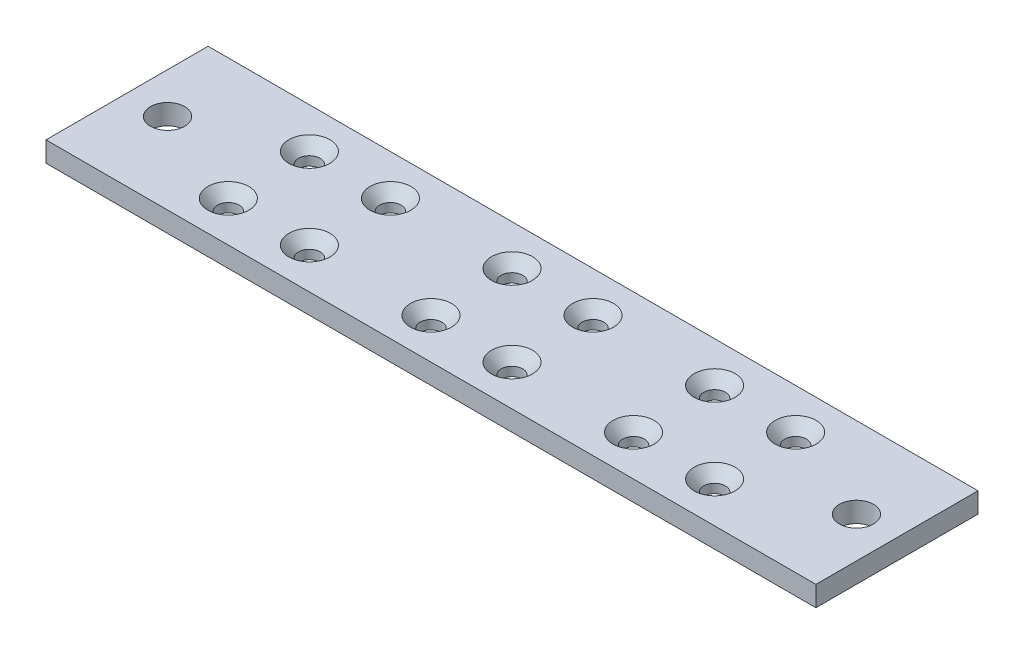
ISO-10303-21;
HEADER;
FILE_DESCRIPTION(('STEP AP214'),'2;1');
FILE_NAME('part.step','',(''),(''),'','','');
FILE_SCHEMA(('AUTOMOTIVE_DESIGN { 1 0 10303 214 1 1 1 1 }'));
ENDSEC;
DATA;
#1=APPLICATION_CONTEXT('core data for automotive mechanical design processes');
#2=APPLICATION_PROTOCOL_DEFINITION('international standard','automotive_design',2000,#1);
#3=PRODUCT_CONTEXT('',#1,'mechanical');
#4=PRODUCT('Part','Part','',(#3));
#5=PRODUCT_RELATED_PRODUCT_CATEGORY('part','',(#4));
#6=PRODUCT_DEFINITION_FORMATION('','',#4);
#7=PRODUCT_DEFINITION_CONTEXT('part definition',#1,'design');
#8=PRODUCT_DEFINITION('design','',#6,#7);
#9=PRODUCT_DEFINITION_SHAPE('','',#8);
#10=(LENGTH_UNIT() NAMED_UNIT(*) SI_UNIT(.MILLI.,.METRE.));
#11=(NAMED_UNIT(*) PLANE_ANGLE_UNIT() SI_UNIT($,.RADIAN.));
#12=(NAMED_UNIT(*) SI_UNIT($,.STERADIAN.) SOLID_ANGLE_UNIT());
#13=UNCERTAINTY_MEASURE_WITH_UNIT(LENGTH_MEASURE(1.E-05),#10,'distance_accuracy_value','');
#14=(GEOMETRIC_REPRESENTATION_CONTEXT(3) GLOBAL_UNCERTAINTY_ASSIGNED_CONTEXT((#13)) GLOBAL_UNIT_ASSIGNED_CONTEXT((#10,
#11,#12)) REPRESENTATION_CONTEXT('',''));
#15=CARTESIAN_POINT('',(0.,0.,0.));
#16=DIRECTION('',(0.,0.,1.));
#17=DIRECTION('',(1.,0.,0.));
#18=AXIS2_PLACEMENT_3D('',#15,#16,#17);
#19=CARTESIAN_POINT('',(120.65,6.35,25.4));
#20=DIRECTION('',(-1.,0.,0.));
#21=DIRECTION('',(0.,0.,1.));
#22=AXIS2_PLACEMENT_3D('',#19,#20,#21);
#23=PLANE('',#22);
#24=DIRECTION('',(0.,0.,-1.));
#25=VECTOR('',#24,1.);
#26=CARTESIAN_POINT('',(120.65,0.,25.4));
#27=LINE('',#26,#25);
#28=CARTESIAN_POINT('',(120.65,0.,25.4));
#29=VERTEX_POINT('',#28);
#30=CARTESIAN_POINT('',(120.65,0.,-25.4));
#31=VERTEX_POINT('',#30);
#32=EDGE_CURVE('E108',#29,#31,#27,.T.);
#33=ORIENTED_EDGE('',*,*,#32,.T.);
#34=DIRECTION('',(0.,-1.,0.));
#35=VECTOR('',#34,1.);
#36=CARTESIAN_POINT('',(120.65,6.35,-25.4));
#37=LINE('',#36,#35);
#38=CARTESIAN_POINT('',(120.65,6.35,-25.4));
#39=VERTEX_POINT('',#38);
#40=EDGE_CURVE('E11',#39,#31,#37,.T.);
#41=ORIENTED_EDGE('',*,*,#40,.F.);
#42=DIRECTION('',(0.,0.,-1.));
#43=VECTOR('',#42,1.);
#44=CARTESIAN_POINT('',(120.65,6.35,25.4));
#45=LINE('',#44,#43);
#46=CARTESIAN_POINT('',(120.65,6.35,25.4));
#47=VERTEX_POINT('',#46);
#48=EDGE_CURVE('E96',#47,#39,#45,.T.);
#49=ORIENTED_EDGE('',*,*,#48,.F.);
#50=DIRECTION('',(0.,-1.,0.));
#51=VECTOR('',#50,1.);
#52=CARTESIAN_POINT('',(120.65,6.35,25.4));
#53=LINE('',#52,#51);
#54=EDGE_CURVE('E104',#47,#29,#53,.T.);
#55=ORIENTED_EDGE('',*,*,#54,.T.);
#56=EDGE_LOOP('',(#33,#41,#49,#55));
#57=FACE_BOUND('',#56,.T.);
#58=ADVANCED_FACE('F45',(#57),#23,.F.);
#59=CARTESIAN_POINT('',(-120.65,6.35,-25.4));
#60=DIRECTION('',(0.,0.,1.));
#61=DIRECTION('',(1.,0.,0.));
#62=AXIS2_PLACEMENT_3D('',#59,#60,#61);
#63=PLANE('',#62);
#64=DIRECTION('',(-1.,0.,0.));
#65=VECTOR('',#64,1.);
#66=CARTESIAN_POINT('',(-120.65,0.,-25.4));
#67=LINE('',#66,#65);
#68=CARTESIAN_POINT('',(-120.65,0.,-25.4));
#69=VERTEX_POINT('',#68);
#70=EDGE_CURVE('E100',#31,#69,#67,.T.);
#71=ORIENTED_EDGE('',*,*,#70,.T.);
#72=DIRECTION('',(0.,-1.,0.));
#73=VECTOR('',#72,1.);
#74=CARTESIAN_POINT('',(-120.65,6.35,-25.4));
#75=LINE('',#74,#73);
#76=CARTESIAN_POINT('',(-120.65,6.35,-25.4));
#77=VERTEX_POINT('',#76);
#78=EDGE_CURVE('E53',#77,#69,#75,.T.);
#79=ORIENTED_EDGE('',*,*,#78,.F.);
#80=DIRECTION('',(-1.,0.,0.));
#81=VECTOR('',#80,1.);
#82=CARTESIAN_POINT('',(-120.65,6.35,-25.4));
#83=LINE('',#82,#81);
#84=EDGE_CURVE('E91',#39,#77,#83,.T.);
#85=ORIENTED_EDGE('',*,*,#84,.F.);
#86=ORIENTED_EDGE('',*,*,#40,.T.);
#87=EDGE_LOOP('',(#71,#79,#85,#86));
#88=FACE_BOUND('',#87,.T.);
#89=ADVANCED_FACE('F99',(#88),#63,.F.);
#90=CARTESIAN_POINT('',(-120.65,6.35,25.4));
#91=DIRECTION('',(1.,0.,0.));
#92=DIRECTION('',(0.,0.,-1.));
#93=AXIS2_PLACEMENT_3D('',#90,#91,#92);
#94=PLANE('',#93);
#95=DIRECTION('',(0.,0.,1.));
#96=VECTOR('',#95,1.);
#97=CARTESIAN_POINT('',(-120.65,0.,25.4));
#98=LINE('',#97,#96);
#99=CARTESIAN_POINT('',(-120.65,0.,25.4));
#100=VERTEX_POINT('',#99);
#101=EDGE_CURVE('E78',#69,#100,#98,.T.);
#102=ORIENTED_EDGE('',*,*,#101,.T.);
#103=DIRECTION('',(0.,-1.,0.));
#104=VECTOR('',#103,1.);
#105=CARTESIAN_POINT('',(-120.65,6.35,25.4));
#106=LINE('',#105,#104);
#107=CARTESIAN_POINT('',(-120.65,6.35,25.4));
#108=VERTEX_POINT('',#107);
#109=EDGE_CURVE('E101',#108,#100,#106,.T.);
#110=ORIENTED_EDGE('',*,*,#109,.F.);
#111=DIRECTION('',(0.,0.,1.));
#112=VECTOR('',#111,1.);
#113=CARTESIAN_POINT('',(-120.65,6.35,25.4));
#114=LINE('',#113,#112);
#115=EDGE_CURVE('E94',#77,#108,#114,.T.);
#116=ORIENTED_EDGE('',*,*,#115,.F.);
#117=ORIENTED_EDGE('',*,*,#78,.T.);
#118=EDGE_LOOP('',(#102,#110,#116,#117));
#119=FACE_BOUND('',#118,.T.);
#120=ADVANCED_FACE('F102',(#119),#94,.F.);
#121=CARTESIAN_POINT('',(-120.65,6.35,25.4));
#122=DIRECTION('',(0.,0.,-1.));
#123=DIRECTION('',(-1.,0.,0.));
#124=AXIS2_PLACEMENT_3D('',#121,#122,#123);
#125=PLANE('',#124);
#126=DIRECTION('',(1.,0.,0.));
#127=VECTOR('',#126,1.);
#128=CARTESIAN_POINT('',(-120.65,0.,25.4));
#129=LINE('',#128,#127);
#130=EDGE_CURVE('E84',#100,#29,#129,.T.);
#131=ORIENTED_EDGE('',*,*,#130,.T.);
#132=ORIENTED_EDGE('',*,*,#54,.F.);
#133=DIRECTION('',(1.,0.,0.));
#134=VECTOR('',#133,1.);
#135=CARTESIAN_POINT('',(-120.65,6.35,25.4));
#136=LINE('',#135,#134);
#137=EDGE_CURVE('E61',#108,#47,#136,.T.);
#138=ORIENTED_EDGE('',*,*,#137,.F.);
#139=ORIENTED_EDGE('',*,*,#109,.T.);
#140=EDGE_LOOP('',(#131,#132,#138,#139));
#141=FACE_BOUND('',#140,.T.);
#142=ADVANCED_FACE('F116',(#141),#125,.F.);
#143=CARTESIAN_POINT('',(0.,6.35,0.));
#144=DIRECTION('',(0.,-1.,0.));
#145=DIRECTION('',(0.,0.,-1.));
#146=AXIS2_PLACEMENT_3D('',#143,#144,#145);
#147=PLANE('',#146);
#148=CARTESIAN_POINT('',(-107.95,6.35,0.));
#149=DIRECTION('',(0.,1.,0.));
#150=DIRECTION('',(0.,0.,1.));
#151=AXIS2_PLACEMENT_3D('',#148,#149,#150);
#152=CIRCLE('',#151,5.35813);
#153=CARTESIAN_POINT('',(-107.95,6.35,5.35813000000002));
#154=VERTEX_POINT('',#153);
#155=EDGE_CURVE('E238',#154,#154,#152,.T.);
#156=ORIENTED_EDGE('',*,*,#155,.F.);
#157=EDGE_LOOP('',(#156));
#158=FACE_BOUND('',#157,.T.);
#159=CARTESIAN_POINT('',(107.95,6.35,0.));
#160=DIRECTION('',(0.,1.,0.));
#161=DIRECTION('',(0.,0.,1.));
#162=AXIS2_PLACEMENT_3D('',#159,#160,#161);
#163=CIRCLE('',#162,5.35813);
#164=CARTESIAN_POINT('',(107.95,6.35,5.35812999999998));
#165=VERTEX_POINT('',#164);
#166=EDGE_CURVE('E232',#165,#165,#163,.T.);
#167=ORIENTED_EDGE('',*,*,#166,.F.);
#168=EDGE_LOOP('',(#167));
#169=FACE_BOUND('',#168,.T.);
#170=CARTESIAN_POINT('',(12.7,6.35,-12.7));
#171=DIRECTION('',(0.,1.,0.));
#172=DIRECTION('',(0.,0.,1.));
#173=AXIS2_PLACEMENT_3D('',#170,#171,#172);
#174=CIRCLE('',#173,6.4389);
#175=CARTESIAN_POINT('',(12.7,6.35,-6.2611));
#176=VERTEX_POINT('',#175);
#177=EDGE_CURVE('E226',#176,#176,#174,.T.);
#178=ORIENTED_EDGE('',*,*,#177,.F.);
#179=EDGE_LOOP('',(#178));
#180=FACE_BOUND('',#179,.T.);
#181=CARTESIAN_POINT('',(-12.7,6.35,12.7));
#182=DIRECTION('',(0.,1.,0.));
#183=DIRECTION('',(0.,0.,1.));
#184=AXIS2_PLACEMENT_3D('',#181,#182,#183);
#185=CIRCLE('',#184,6.4389);
#186=CARTESIAN_POINT('',(-12.7,6.35,19.1389));
#187=VERTEX_POINT('',#186);
#188=EDGE_CURVE('E217',#187,#187,#185,.T.);
#189=ORIENTED_EDGE('',*,*,#188,.F.);
#190=EDGE_LOOP('',(#189));
#191=FACE_BOUND('',#190,.T.);
#192=CARTESIAN_POINT('',(-12.7,6.35,-12.7));
#193=DIRECTION('',(0.,1.,0.));
#194=DIRECTION('',(0.,0.,1.));
#195=AXIS2_PLACEMENT_3D('',#192,#193,#194);
#196=CIRCLE('',#195,6.4389);
#197=CARTESIAN_POINT('',(-12.7,6.35,-6.2611));
#198=VERTEX_POINT('',#197);
#199=EDGE_CURVE('E208',#198,#198,#196,.T.);
#200=ORIENTED_EDGE('',*,*,#199,.F.);
#201=EDGE_LOOP('',(#200));
#202=FACE_BOUND('',#201,.T.);
#203=CARTESIAN_POINT('',(12.7,6.35,12.7));
#204=DIRECTION('',(0.,1.,0.));
#205=DIRECTION('',(0.,0.,1.));
#206=AXIS2_PLACEMENT_3D('',#203,#204,#205);
#207=CIRCLE('',#206,6.4389);
#208=CARTESIAN_POINT('',(12.7,6.35,19.1389));
#209=VERTEX_POINT('',#208);
#210=EDGE_CURVE('E199',#209,#209,#207,.T.);
#211=ORIENTED_EDGE('',*,*,#210,.F.);
#212=EDGE_LOOP('',(#211));
#213=FACE_BOUND('',#212,.T.);
#214=CARTESIAN_POINT('',(-50.8,6.35,-12.7));
#215=DIRECTION('',(0.,1.,0.));
#216=DIRECTION('',(0.,0.,1.));
#217=AXIS2_PLACEMENT_3D('',#214,#215,#216);
#218=CIRCLE('',#217,6.4389);
#219=CARTESIAN_POINT('',(-50.8,6.35,-6.26109999999999));
#220=VERTEX_POINT('',#219);
#221=EDGE_CURVE('E190',#220,#220,#218,.T.);
#222=ORIENTED_EDGE('',*,*,#221,.F.);
#223=EDGE_LOOP('',(#222));
#224=FACE_BOUND('',#223,.T.);
#225=CARTESIAN_POINT('',(-76.2,6.35,12.7));
#226=DIRECTION('',(0.,1.,0.));
#227=DIRECTION('',(0.,0.,1.));
#228=AXIS2_PLACEMENT_3D('',#225,#226,#227);
#229=CIRCLE('',#228,6.4389);
#230=CARTESIAN_POINT('',(-76.2,6.35,19.1389));
#231=VERTEX_POINT('',#230);
#232=EDGE_CURVE('E181',#231,#231,#229,.T.);
#233=ORIENTED_EDGE('',*,*,#232,.F.);
#234=EDGE_LOOP('',(#233));
#235=FACE_BOUND('',#234,.T.);
#236=CARTESIAN_POINT('',(-76.2,6.35,-12.7));
#237=DIRECTION('',(0.,1.,0.));
#238=DIRECTION('',(0.,0.,1.));
#239=AXIS2_PLACEMENT_3D('',#236,#237,#238);
#240=CIRCLE('',#239,6.4389);
#241=CARTESIAN_POINT('',(-76.2,6.35,-6.2611));
#242=VERTEX_POINT('',#241);
#243=EDGE_CURVE('E172',#242,#242,#240,.T.);
#244=ORIENTED_EDGE('',*,*,#243,.F.);
#245=EDGE_LOOP('',(#244));
#246=FACE_BOUND('',#245,.T.);
#247=CARTESIAN_POINT('',(-50.8,6.35,12.7));
#248=DIRECTION('',(0.,1.,0.));
#249=DIRECTION('',(0.,0.,1.));
#250=AXIS2_PLACEMENT_3D('',#247,#248,#249);
#251=CIRCLE('',#250,6.4389);
#252=CARTESIAN_POINT('',(-50.8,6.35,19.1389));
#253=VERTEX_POINT('',#252);
#254=EDGE_CURVE('E163',#253,#253,#251,.T.);
#255=ORIENTED_EDGE('',*,*,#254,.F.);
#256=EDGE_LOOP('',(#255));
#257=FACE_BOUND('',#256,.T.);
#258=CARTESIAN_POINT('',(76.2,6.35,-12.7));
#259=DIRECTION('',(0.,1.,0.));
#260=DIRECTION('',(0.,0.,1.));
#261=AXIS2_PLACEMENT_3D('',#258,#259,#260);
#262=CIRCLE('',#261,6.4389);
#263=CARTESIAN_POINT('',(76.2,6.35,-6.2611));
#264=VERTEX_POINT('',#263);
#265=EDGE_CURVE('E154',#264,#264,#262,.T.);
#266=ORIENTED_EDGE('',*,*,#265,.F.);
#267=EDGE_LOOP('',(#266));
#268=FACE_BOUND('',#267,.T.);
#269=CARTESIAN_POINT('',(50.8,6.35,12.7));
#270=DIRECTION('',(0.,1.,0.));
#271=DIRECTION('',(0.,0.,1.));
#272=AXIS2_PLACEMENT_3D('',#269,#270,#271);
#273=CIRCLE('',#272,6.4389);
#274=CARTESIAN_POINT('',(50.8,6.35,19.1389));
#275=VERTEX_POINT('',#274);
#276=EDGE_CURVE('E145',#275,#275,#273,.T.);
#277=ORIENTED_EDGE('',*,*,#276,.F.);
#278=EDGE_LOOP('',(#277));
#279=FACE_BOUND('',#278,.T.);
#280=CARTESIAN_POINT('',(50.8,6.35,-12.7));
#281=DIRECTION('',(0.,1.,0.));
#282=DIRECTION('',(0.,0.,1.));
#283=AXIS2_PLACEMENT_3D('',#280,#281,#282);
#284=CIRCLE('',#283,6.4389);
#285=CARTESIAN_POINT('',(50.8,6.35,-6.26109999999999));
#286=VERTEX_POINT('',#285);
#287=EDGE_CURVE('E136',#286,#286,#284,.T.);
#288=ORIENTED_EDGE('',*,*,#287,.F.);
#289=EDGE_LOOP('',(#288));
#290=FACE_BOUND('',#289,.T.);
#291=CARTESIAN_POINT('',(76.2,6.35,12.7));
#292=DIRECTION('',(0.,1.,0.));
#293=DIRECTION('',(0.,0.,1.));
#294=AXIS2_PLACEMENT_3D('',#291,#292,#293);
#295=CIRCLE('',#294,6.4389);
#296=CARTESIAN_POINT('',(76.2,6.35,19.1389));
#297=VERTEX_POINT('',#296);
#298=EDGE_CURVE('E127',#297,#297,#295,.T.);
#299=ORIENTED_EDGE('',*,*,#298,.F.);
#300=EDGE_LOOP('',(#299));
#301=FACE_BOUND('',#300,.T.);
#302=ORIENTED_EDGE('',*,*,#48,.T.);
#303=ORIENTED_EDGE('',*,*,#84,.T.);
#304=ORIENTED_EDGE('',*,*,#115,.T.);
#305=ORIENTED_EDGE('',*,*,#137,.T.);
#306=EDGE_LOOP('',(#302,#303,#304,#305));
#307=FACE_BOUND('',#306,.T.);
#308=ADVANCED_FACE('F92',(#158,#169,#180,#191,#202,#213,#224,#235,#246,#257,#268,#279,#290,#301,
#307),#147,.F.);
#309=CARTESIAN_POINT('',(0.,0.,0.));
#310=DIRECTION('',(0.,-1.,0.));
#311=DIRECTION('',(0.,0.,-1.));
#312=AXIS2_PLACEMENT_3D('',#309,#310,#311);
#313=PLANE('',#312);
#314=CARTESIAN_POINT('',(-107.95,0.,0.));
#315=DIRECTION('',(0.,1.,0.));
#316=DIRECTION('',(0.,0.,1.));
#317=AXIS2_PLACEMENT_3D('',#314,#315,#316);
#318=CIRCLE('',#317,5.35813);
#319=CARTESIAN_POINT('',(-107.95,0.,5.35813000000002));
#320=VERTEX_POINT('',#319);
#321=EDGE_CURVE('E235',#320,#320,#318,.T.);
#322=ORIENTED_EDGE('',*,*,#321,.T.);
#323=EDGE_LOOP('',(#322));
#324=FACE_BOUND('',#323,.T.);
#325=CARTESIAN_POINT('',(107.95,0.,0.));
#326=DIRECTION('',(0.,1.,0.));
#327=DIRECTION('',(0.,0.,1.));
#328=AXIS2_PLACEMENT_3D('',#325,#326,#327);
#329=CIRCLE('',#328,5.35813);
#330=CARTESIAN_POINT('',(107.95,0.,5.35812999999998));
#331=VERTEX_POINT('',#330);
#332=EDGE_CURVE('E229',#331,#331,#329,.T.);
#333=ORIENTED_EDGE('',*,*,#332,.T.);
#334=EDGE_LOOP('',(#333));
#335=FACE_BOUND('',#334,.T.);
#336=CARTESIAN_POINT('',(12.7,0.,-12.7));
#337=DIRECTION('',(0.,1.,0.));
#338=DIRECTION('',(0.,0.,1.));
#339=AXIS2_PLACEMENT_3D('',#336,#337,#338);
#340=CIRCLE('',#339,3.3782);
#341=CARTESIAN_POINT('',(12.7,0.,-9.3218));
#342=VERTEX_POINT('',#341);
#343=EDGE_CURVE('E220',#342,#342,#340,.T.);
#344=ORIENTED_EDGE('',*,*,#343,.T.);
#345=EDGE_LOOP('',(#344));
#346=FACE_BOUND('',#345,.T.);
#347=CARTESIAN_POINT('',(-12.7,0.,12.7));
#348=DIRECTION('',(0.,1.,0.));
#349=DIRECTION('',(0.,0.,1.));
#350=AXIS2_PLACEMENT_3D('',#347,#348,#349);
#351=CIRCLE('',#350,3.3782);
#352=CARTESIAN_POINT('',(-12.7,0.,16.0782));
#353=VERTEX_POINT('',#352);
#354=EDGE_CURVE('E211',#353,#353,#351,.T.);
#355=ORIENTED_EDGE('',*,*,#354,.T.);
#356=EDGE_LOOP('',(#355));
#357=FACE_BOUND('',#356,.T.);
#358=CARTESIAN_POINT('',(-12.7,0.,-12.7));
#359=DIRECTION('',(0.,1.,0.));
#360=DIRECTION('',(0.,0.,1.));
#361=AXIS2_PLACEMENT_3D('',#358,#359,#360);
#362=CIRCLE('',#361,3.3782);
#363=CARTESIAN_POINT('',(-12.7,0.,-9.3218));
#364=VERTEX_POINT('',#363);
#365=EDGE_CURVE('E202',#364,#364,#362,.T.);
#366=ORIENTED_EDGE('',*,*,#365,.T.);
#367=EDGE_LOOP('',(#366));
#368=FACE_BOUND('',#367,.T.);
#369=CARTESIAN_POINT('',(12.7,0.,12.7));
#370=DIRECTION('',(0.,1.,0.));
#371=DIRECTION('',(0.,0.,1.));
#372=AXIS2_PLACEMENT_3D('',#369,#370,#371);
#373=CIRCLE('',#372,3.3782);
#374=CARTESIAN_POINT('',(12.7,0.,16.0782));
#375=VERTEX_POINT('',#374);
#376=EDGE_CURVE('E193',#375,#375,#373,.T.);
#377=ORIENTED_EDGE('',*,*,#376,.T.);
#378=EDGE_LOOP('',(#377));
#379=FACE_BOUND('',#378,.T.);
#380=CARTESIAN_POINT('',(-50.8,0.,-12.7));
#381=DIRECTION('',(0.,1.,0.));
#382=DIRECTION('',(0.,0.,1.));
#383=AXIS2_PLACEMENT_3D('',#380,#381,#382);
#384=CIRCLE('',#383,3.3782);
#385=CARTESIAN_POINT('',(-50.8,0.,-9.3218));
#386=VERTEX_POINT('',#385);
#387=EDGE_CURVE('E184',#386,#386,#384,.T.);
#388=ORIENTED_EDGE('',*,*,#387,.T.);
#389=EDGE_LOOP('',(#388));
#390=FACE_BOUND('',#389,.T.);
#391=CARTESIAN_POINT('',(-76.2,0.,12.7));
#392=DIRECTION('',(0.,1.,0.));
#393=DIRECTION('',(0.,0.,1.));
#394=AXIS2_PLACEMENT_3D('',#391,#392,#393);
#395=CIRCLE('',#394,3.3782);
#396=CARTESIAN_POINT('',(-76.2,0.,16.0782));
#397=VERTEX_POINT('',#396);
#398=EDGE_CURVE('E175',#397,#397,#395,.T.);
#399=ORIENTED_EDGE('',*,*,#398,.T.);
#400=EDGE_LOOP('',(#399));
#401=FACE_BOUND('',#400,.T.);
#402=CARTESIAN_POINT('',(-76.2,0.,-12.7));
#403=DIRECTION('',(0.,1.,0.));
#404=DIRECTION('',(0.,0.,1.));
#405=AXIS2_PLACEMENT_3D('',#402,#403,#404);
#406=CIRCLE('',#405,3.3782);
#407=CARTESIAN_POINT('',(-76.2,0.,-9.3218));
#408=VERTEX_POINT('',#407);
#409=EDGE_CURVE('E166',#408,#408,#406,.T.);
#410=ORIENTED_EDGE('',*,*,#409,.T.);
#411=EDGE_LOOP('',(#410));
#412=FACE_BOUND('',#411,.T.);
#413=CARTESIAN_POINT('',(-50.8,0.,12.7));
#414=DIRECTION('',(0.,1.,0.));
#415=DIRECTION('',(0.,0.,1.));
#416=AXIS2_PLACEMENT_3D('',#413,#414,#415);
#417=CIRCLE('',#416,3.3782);
#418=CARTESIAN_POINT('',(-50.8,0.,16.0782));
#419=VERTEX_POINT('',#418);
#420=EDGE_CURVE('E157',#419,#419,#417,.T.);
#421=ORIENTED_EDGE('',*,*,#420,.T.);
#422=EDGE_LOOP('',(#421));
#423=FACE_BOUND('',#422,.T.);
#424=CARTESIAN_POINT('',(76.2,0.,-12.7));
#425=DIRECTION('',(0.,1.,0.));
#426=DIRECTION('',(0.,0.,1.));
#427=AXIS2_PLACEMENT_3D('',#424,#425,#426);
#428=CIRCLE('',#427,3.3782);
#429=CARTESIAN_POINT('',(76.2,0.,-9.3218));
#430=VERTEX_POINT('',#429);
#431=EDGE_CURVE('E148',#430,#430,#428,.T.);
#432=ORIENTED_EDGE('',*,*,#431,.T.);
#433=EDGE_LOOP('',(#432));
#434=FACE_BOUND('',#433,.T.);
#435=CARTESIAN_POINT('',(50.8,0.,12.7));
#436=DIRECTION('',(0.,1.,0.));
#437=DIRECTION('',(0.,0.,1.));
#438=AXIS2_PLACEMENT_3D('',#435,#436,#437);
#439=CIRCLE('',#438,3.3782);
#440=CARTESIAN_POINT('',(50.8,0.,16.0782));
#441=VERTEX_POINT('',#440);
#442=EDGE_CURVE('E139',#441,#441,#439,.T.);
#443=ORIENTED_EDGE('',*,*,#442,.T.);
#444=EDGE_LOOP('',(#443));
#445=FACE_BOUND('',#444,.T.);
#446=CARTESIAN_POINT('',(50.8,0.,-12.7));
#447=DIRECTION('',(0.,1.,0.));
#448=DIRECTION('',(0.,0.,1.));
#449=AXIS2_PLACEMENT_3D('',#446,#447,#448);
#450=CIRCLE('',#449,3.3782);
#451=CARTESIAN_POINT('',(50.8,0.,-9.3218));
#452=VERTEX_POINT('',#451);
#453=EDGE_CURVE('E130',#452,#452,#450,.T.);
#454=ORIENTED_EDGE('',*,*,#453,.T.);
#455=EDGE_LOOP('',(#454));
#456=FACE_BOUND('',#455,.T.);
#457=CARTESIAN_POINT('',(76.2,0.,12.7));
#458=DIRECTION('',(0.,1.,0.));
#459=DIRECTION('',(0.,0.,1.));
#460=AXIS2_PLACEMENT_3D('',#457,#458,#459);
#461=CIRCLE('',#460,3.3782);
#462=CARTESIAN_POINT('',(76.2,0.,16.0782));
#463=VERTEX_POINT('',#462);
#464=EDGE_CURVE('E111',#463,#463,#461,.T.);
#465=ORIENTED_EDGE('',*,*,#464,.T.);
#466=EDGE_LOOP('',(#465));
#467=FACE_BOUND('',#466,.T.);
#468=ORIENTED_EDGE('',*,*,#32,.F.);
#469=ORIENTED_EDGE('',*,*,#130,.F.);
#470=ORIENTED_EDGE('',*,*,#101,.F.);
#471=ORIENTED_EDGE('',*,*,#70,.F.);
#472=EDGE_LOOP('',(#468,#469,#470,#471));
#473=FACE_BOUND('',#472,.T.);
#474=ADVANCED_FACE('F119',(#324,#335,#346,#357,#368,#379,#390,#401,#412,#423,#434,#445,#456,
#467,#473),#313,.T.);
#475=CARTESIAN_POINT('',(76.2,6.35,12.7));
#476=DIRECTION('',(0.,1.,0.));
#477=DIRECTION('',(0.,0.,1.));
#478=AXIS2_PLACEMENT_3D('',#475,#476,#477);
#479=CYLINDRICAL_SURFACE('',#478,3.3782);
#480=ORIENTED_EDGE('',*,*,#464,.F.);
#481=EDGE_LOOP('',(#480));
#482=FACE_BOUND('',#481,.T.);
#483=CARTESIAN_POINT('',(76.2,2.82906741601865,12.7));
#484=DIRECTION('',(0.,1.,0.));
#485=DIRECTION('',(0.,0.,1.));
#486=AXIS2_PLACEMENT_3D('',#483,#484,#485);
#487=CIRCLE('',#486,3.3782);
#488=CARTESIAN_POINT('',(76.2,2.82906741601865,16.0782));
#489=VERTEX_POINT('',#488);
#490=EDGE_CURVE('E124',#489,#489,#487,.T.);
#491=ORIENTED_EDGE('',*,*,#490,.T.);
#492=EDGE_LOOP('',(#491));
#493=FACE_BOUND('',#492,.T.);
#494=ADVANCED_FACE('F276',(#482,#493),#479,.F.);
#495=CARTESIAN_POINT('',(76.2,6.35,12.7));
#496=DIRECTION('',(0.,1.,0.));
#497=DIRECTION('',(0.,0.,1.));
#498=AXIS2_PLACEMENT_3D('',#495,#496,#497);
#499=CONICAL_SURFACE('',#498,6.4389,0.715584993317674);
#500=ORIENTED_EDGE('',*,*,#490,.F.);
#501=EDGE_LOOP('',(#500));
#502=FACE_BOUND('',#501,.T.);
#503=ORIENTED_EDGE('',*,*,#298,.T.);
#504=EDGE_LOOP('',(#503));
#505=FACE_BOUND('',#504,.T.);
#506=ADVANCED_FACE('F273',(#502,#505),#499,.F.);
#507=CARTESIAN_POINT('',(50.8,6.35,-12.7));
#508=DIRECTION('',(0.,1.,0.));
#509=DIRECTION('',(0.,0.,1.));
#510=AXIS2_PLACEMENT_3D('',#507,#508,#509);
#511=CYLINDRICAL_SURFACE('',#510,3.3782);
#512=ORIENTED_EDGE('',*,*,#453,.F.);
#513=EDGE_LOOP('',(#512));
#514=FACE_BOUND('',#513,.T.);
#515=CARTESIAN_POINT('',(50.8,2.82906741601865,-12.7));
#516=DIRECTION('',(0.,1.,0.));
#517=DIRECTION('',(0.,0.,1.));
#518=AXIS2_PLACEMENT_3D('',#515,#516,#517);
#519=CIRCLE('',#518,3.3782);
#520=CARTESIAN_POINT('',(50.8,2.82906741601865,-9.3218));
#521=VERTEX_POINT('',#520);
#522=EDGE_CURVE('E133',#521,#521,#519,.T.);
#523=ORIENTED_EDGE('',*,*,#522,.T.);
#524=EDGE_LOOP('',(#523));
#525=FACE_BOUND('',#524,.T.);
#526=ADVANCED_FACE('F275',(#514,#525),#511,.F.);
#527=CARTESIAN_POINT('',(50.8,6.35,-12.7));
#528=DIRECTION('',(0.,1.,0.));
#529=DIRECTION('',(0.,0.,1.));
#530=AXIS2_PLACEMENT_3D('',#527,#528,#529);
#531=CONICAL_SURFACE('',#530,6.4389,0.715584993317675);
#532=ORIENTED_EDGE('',*,*,#522,.F.);
#533=EDGE_LOOP('',(#532));
#534=FACE_BOUND('',#533,.T.);
#535=ORIENTED_EDGE('',*,*,#287,.T.);
#536=EDGE_LOOP('',(#535));
#537=FACE_BOUND('',#536,.T.);
#538=ADVANCED_FACE('F284',(#534,#537),#531,.F.);
#539=CARTESIAN_POINT('',(50.8,6.35,12.7));
#540=DIRECTION('',(0.,1.,0.));
#541=DIRECTION('',(0.,0.,1.));
#542=AXIS2_PLACEMENT_3D('',#539,#540,#541);
#543=CYLINDRICAL_SURFACE('',#542,3.3782);
#544=ORIENTED_EDGE('',*,*,#442,.F.);
#545=EDGE_LOOP('',(#544));
#546=FACE_BOUND('',#545,.T.);
#547=CARTESIAN_POINT('',(50.8,2.82906741601865,12.7));
#548=DIRECTION('',(0.,1.,0.));
#549=DIRECTION('',(0.,0.,1.));
#550=AXIS2_PLACEMENT_3D('',#547,#548,#549);
#551=CIRCLE('',#550,3.3782);
#552=CARTESIAN_POINT('',(50.8,2.82906741601865,16.0782));
#553=VERTEX_POINT('',#552);
#554=EDGE_CURVE('E142',#553,#553,#551,.T.);
#555=ORIENTED_EDGE('',*,*,#554,.T.);
#556=EDGE_LOOP('',(#555));
#557=FACE_BOUND('',#556,.T.);
#558=ADVANCED_FACE('F340',(#546,#557),#543,.F.);
#559=CARTESIAN_POINT('',(50.8,6.35,12.7));
#560=DIRECTION('',(0.,1.,0.));
#561=DIRECTION('',(0.,0.,1.));
#562=AXIS2_PLACEMENT_3D('',#559,#560,#561);
#563=CONICAL_SURFACE('',#562,6.4389,0.715584993317675);
#564=ORIENTED_EDGE('',*,*,#554,.F.);
#565=EDGE_LOOP('',(#564));
#566=FACE_BOUND('',#565,.T.);
#567=ORIENTED_EDGE('',*,*,#276,.T.);
#568=EDGE_LOOP('',(#567));
#569=FACE_BOUND('',#568,.T.);
#570=ADVANCED_FACE('F346',(#566,#569),#563,.F.);
#571=CARTESIAN_POINT('',(76.2,6.35,-12.7));
#572=DIRECTION('',(0.,1.,0.));
#573=DIRECTION('',(0.,0.,1.));
#574=AXIS2_PLACEMENT_3D('',#571,#572,#573);
#575=CYLINDRICAL_SURFACE('',#574,3.3782);
#576=ORIENTED_EDGE('',*,*,#431,.F.);
#577=EDGE_LOOP('',(#576));
#578=FACE_BOUND('',#577,.T.);
#579=CARTESIAN_POINT('',(76.2,2.82906741601865,-12.7));
#580=DIRECTION('',(0.,1.,0.));
#581=DIRECTION('',(0.,0.,1.));
#582=AXIS2_PLACEMENT_3D('',#579,#580,#581);
#583=CIRCLE('',#582,3.3782);
#584=CARTESIAN_POINT('',(76.2,2.82906741601865,-9.3218));
#585=VERTEX_POINT('',#584);
#586=EDGE_CURVE('E151',#585,#585,#583,.T.);
#587=ORIENTED_EDGE('',*,*,#586,.T.);
#588=EDGE_LOOP('',(#587));
#589=FACE_BOUND('',#588,.T.);
#590=ADVANCED_FACE('F351',(#578,#589),#575,.F.);
#591=CARTESIAN_POINT('',(76.2,6.35,-12.7));
#592=DIRECTION('',(0.,1.,0.));
#593=DIRECTION('',(0.,0.,1.));
#594=AXIS2_PLACEMENT_3D('',#591,#592,#593);
#595=CONICAL_SURFACE('',#594,6.4389,0.715584993317674);
#596=ORIENTED_EDGE('',*,*,#586,.F.);
#597=EDGE_LOOP('',(#596));
#598=FACE_BOUND('',#597,.T.);
#599=ORIENTED_EDGE('',*,*,#265,.T.);
#600=EDGE_LOOP('',(#599));
#601=FACE_BOUND('',#600,.T.);
#602=ADVANCED_FACE('F355',(#598,#601),#595,.F.);
#603=CARTESIAN_POINT('',(-50.8,6.35,12.7));
#604=DIRECTION('',(0.,1.,0.));
#605=DIRECTION('',(0.,0.,1.));
#606=AXIS2_PLACEMENT_3D('',#603,#604,#605);
#607=CYLINDRICAL_SURFACE('',#606,3.3782);
#608=ORIENTED_EDGE('',*,*,#420,.F.);
#609=EDGE_LOOP('',(#608));
#610=FACE_BOUND('',#609,.T.);
#611=CARTESIAN_POINT('',(-50.8,2.82906741601865,12.7));
#612=DIRECTION('',(0.,1.,0.));
#613=DIRECTION('',(0.,0.,1.));
#614=AXIS2_PLACEMENT_3D('',#611,#612,#613);
#615=CIRCLE('',#614,3.3782);
#616=CARTESIAN_POINT('',(-50.8,2.82906741601865,16.0782));
#617=VERTEX_POINT('',#616);
#618=EDGE_CURVE('E160',#617,#617,#615,.T.);
#619=ORIENTED_EDGE('',*,*,#618,.T.);
#620=EDGE_LOOP('',(#619));
#621=FACE_BOUND('',#620,.T.);
#622=ADVANCED_FACE('F359',(#610,#621),#607,.F.);
#623=CARTESIAN_POINT('',(-50.8,6.35,12.7));
#624=DIRECTION('',(0.,1.,0.));
#625=DIRECTION('',(0.,0.,1.));
#626=AXIS2_PLACEMENT_3D('',#623,#624,#625);
#627=CONICAL_SURFACE('',#626,6.4389,0.715584993317674);
#628=ORIENTED_EDGE('',*,*,#618,.F.);
#629=EDGE_LOOP('',(#628));
#630=FACE_BOUND('',#629,.T.);
#631=ORIENTED_EDGE('',*,*,#254,.T.);
#632=EDGE_LOOP('',(#631));
#633=FACE_BOUND('',#632,.T.);
#634=ADVANCED_FACE('F363',(#630,#633),#627,.F.);
#635=CARTESIAN_POINT('',(-76.2,6.35,-12.7));
#636=DIRECTION('',(0.,1.,0.));
#637=DIRECTION('',(0.,0.,1.));
#638=AXIS2_PLACEMENT_3D('',#635,#636,#637);
#639=CYLINDRICAL_SURFACE('',#638,3.3782);
#640=ORIENTED_EDGE('',*,*,#409,.F.);
#641=EDGE_LOOP('',(#640));
#642=FACE_BOUND('',#641,.T.);
#643=CARTESIAN_POINT('',(-76.2,2.82906741601865,-12.7));
#644=DIRECTION('',(0.,1.,0.));
#645=DIRECTION('',(0.,0.,1.));
#646=AXIS2_PLACEMENT_3D('',#643,#644,#645);
#647=CIRCLE('',#646,3.3782);
#648=CARTESIAN_POINT('',(-76.2,2.82906741601865,-9.3218));
#649=VERTEX_POINT('',#648);
#650=EDGE_CURVE('E169',#649,#649,#647,.T.);
#651=ORIENTED_EDGE('',*,*,#650,.T.);
#652=EDGE_LOOP('',(#651));
#653=FACE_BOUND('',#652,.T.);
#654=ADVANCED_FACE('F367',(#642,#653),#639,.F.);
#655=CARTESIAN_POINT('',(-76.2,6.35,-12.7));
#656=DIRECTION('',(0.,1.,0.));
#657=DIRECTION('',(0.,0.,1.));
#658=AXIS2_PLACEMENT_3D('',#655,#656,#657);
#659=CONICAL_SURFACE('',#658,6.4389,0.715584993317674);
#660=ORIENTED_EDGE('',*,*,#650,.F.);
#661=EDGE_LOOP('',(#660));
#662=FACE_BOUND('',#661,.T.);
#663=ORIENTED_EDGE('',*,*,#243,.T.);
#664=EDGE_LOOP('',(#663));
#665=FACE_BOUND('',#664,.T.);
#666=ADVANCED_FACE('F371',(#662,#665),#659,.F.);
#667=CARTESIAN_POINT('',(-76.2,6.35,12.7));
#668=DIRECTION('',(0.,1.,0.));
#669=DIRECTION('',(0.,0.,1.));
#670=AXIS2_PLACEMENT_3D('',#667,#668,#669);
#671=CYLINDRICAL_SURFACE('',#670,3.3782);
#672=ORIENTED_EDGE('',*,*,#398,.F.);
#673=EDGE_LOOP('',(#672));
#674=FACE_BOUND('',#673,.T.);
#675=CARTESIAN_POINT('',(-76.2,2.82906741601865,12.7));
#676=DIRECTION('',(0.,1.,0.));
#677=DIRECTION('',(0.,0.,1.));
#678=AXIS2_PLACEMENT_3D('',#675,#676,#677);
#679=CIRCLE('',#678,3.3782);
#680=CARTESIAN_POINT('',(-76.2,2.82906741601865,16.0782));
#681=VERTEX_POINT('',#680);
#682=EDGE_CURVE('E178',#681,#681,#679,.T.);
#683=ORIENTED_EDGE('',*,*,#682,.T.);
#684=EDGE_LOOP('',(#683));
#685=FACE_BOUND('',#684,.T.);
#686=ADVANCED_FACE('F375',(#674,#685),#671,.F.);
#687=CARTESIAN_POINT('',(-76.2,6.35,12.7));
#688=DIRECTION('',(0.,1.,0.));
#689=DIRECTION('',(0.,0.,1.));
#690=AXIS2_PLACEMENT_3D('',#687,#688,#689);
#691=CONICAL_SURFACE('',#690,6.4389,0.715584993317674);
#692=ORIENTED_EDGE('',*,*,#682,.F.);
#693=EDGE_LOOP('',(#692));
#694=FACE_BOUND('',#693,.T.);
#695=ORIENTED_EDGE('',*,*,#232,.T.);
#696=EDGE_LOOP('',(#695));
#697=FACE_BOUND('',#696,.T.);
#698=ADVANCED_FACE('F379',(#694,#697),#691,.F.);
#699=CARTESIAN_POINT('',(-50.8,6.35,-12.7));
#700=DIRECTION('',(0.,1.,0.));
#701=DIRECTION('',(0.,0.,1.));
#702=AXIS2_PLACEMENT_3D('',#699,#700,#701);
#703=CYLINDRICAL_SURFACE('',#702,3.3782);
#704=ORIENTED_EDGE('',*,*,#387,.F.);
#705=EDGE_LOOP('',(#704));
#706=FACE_BOUND('',#705,.T.);
#707=CARTESIAN_POINT('',(-50.8,2.82906741601865,-12.7));
#708=DIRECTION('',(0.,1.,0.));
#709=DIRECTION('',(0.,0.,1.));
#710=AXIS2_PLACEMENT_3D('',#707,#708,#709);
#711=CIRCLE('',#710,3.3782);
#712=CARTESIAN_POINT('',(-50.8,2.82906741601865,-9.3218));
#713=VERTEX_POINT('',#712);
#714=EDGE_CURVE('E187',#713,#713,#711,.T.);
#715=ORIENTED_EDGE('',*,*,#714,.T.);
#716=EDGE_LOOP('',(#715));
#717=FACE_BOUND('',#716,.T.);
#718=ADVANCED_FACE('F383',(#706,#717),#703,.F.);
#719=CARTESIAN_POINT('',(-50.8,6.35,-12.7));
#720=DIRECTION('',(0.,1.,0.));
#721=DIRECTION('',(0.,0.,1.));
#722=AXIS2_PLACEMENT_3D('',#719,#720,#721);
#723=CONICAL_SURFACE('',#722,6.4389,0.715584993317675);
#724=ORIENTED_EDGE('',*,*,#714,.F.);
#725=EDGE_LOOP('',(#724));
#726=FACE_BOUND('',#725,.T.);
#727=ORIENTED_EDGE('',*,*,#221,.T.);
#728=EDGE_LOOP('',(#727));
#729=FACE_BOUND('',#728,.T.);
#730=ADVANCED_FACE('F387',(#726,#729),#723,.F.);
#731=CARTESIAN_POINT('',(12.7,6.35,12.7));
#732=DIRECTION('',(0.,1.,0.));
#733=DIRECTION('',(0.,0.,1.));
#734=AXIS2_PLACEMENT_3D('',#731,#732,#733);
#735=CYLINDRICAL_SURFACE('',#734,3.3782);
#736=ORIENTED_EDGE('',*,*,#376,.F.);
#737=EDGE_LOOP('',(#736));
#738=FACE_BOUND('',#737,.T.);
#739=CARTESIAN_POINT('',(12.7,2.82906741601865,12.7));
#740=DIRECTION('',(0.,1.,0.));
#741=DIRECTION('',(0.,0.,1.));
#742=AXIS2_PLACEMENT_3D('',#739,#740,#741);
#743=CIRCLE('',#742,3.3782);
#744=CARTESIAN_POINT('',(12.7,2.82906741601865,16.0782));
#745=VERTEX_POINT('',#744);
#746=EDGE_CURVE('E196',#745,#745,#743,.T.);
#747=ORIENTED_EDGE('',*,*,#746,.T.);
#748=EDGE_LOOP('',(#747));
#749=FACE_BOUND('',#748,.T.);
#750=ADVANCED_FACE('F391',(#738,#749),#735,.F.);
#751=CARTESIAN_POINT('',(12.7,6.35,12.7));
#752=DIRECTION('',(0.,1.,0.));
#753=DIRECTION('',(0.,0.,1.));
#754=AXIS2_PLACEMENT_3D('',#751,#752,#753);
#755=CONICAL_SURFACE('',#754,6.4389,0.715584993317675);
#756=ORIENTED_EDGE('',*,*,#746,.F.);
#757=EDGE_LOOP('',(#756));
#758=FACE_BOUND('',#757,.T.);
#759=ORIENTED_EDGE('',*,*,#210,.T.);
#760=EDGE_LOOP('',(#759));
#761=FACE_BOUND('',#760,.T.);
#762=ADVANCED_FACE('F395',(#758,#761),#755,.F.);
#763=CARTESIAN_POINT('',(-12.7,6.35,-12.7));
#764=DIRECTION('',(0.,1.,0.));
#765=DIRECTION('',(0.,0.,1.));
#766=AXIS2_PLACEMENT_3D('',#763,#764,#765);
#767=CYLINDRICAL_SURFACE('',#766,3.3782);
#768=ORIENTED_EDGE('',*,*,#365,.F.);
#769=EDGE_LOOP('',(#768));
#770=FACE_BOUND('',#769,.T.);
#771=CARTESIAN_POINT('',(-12.7,2.82906741601865,-12.7));
#772=DIRECTION('',(0.,1.,0.));
#773=DIRECTION('',(0.,0.,1.));
#774=AXIS2_PLACEMENT_3D('',#771,#772,#773);
#775=CIRCLE('',#774,3.3782);
#776=CARTESIAN_POINT('',(-12.7,2.82906741601865,-9.3218));
#777=VERTEX_POINT('',#776);
#778=EDGE_CURVE('E205',#777,#777,#775,.T.);
#779=ORIENTED_EDGE('',*,*,#778,.T.);
#780=EDGE_LOOP('',(#779));
#781=FACE_BOUND('',#780,.T.);
#782=ADVANCED_FACE('F399',(#770,#781),#767,.F.);
#783=CARTESIAN_POINT('',(-12.7,6.35,-12.7));
#784=DIRECTION('',(0.,1.,0.));
#785=DIRECTION('',(0.,0.,1.));
#786=AXIS2_PLACEMENT_3D('',#783,#784,#785);
#787=CONICAL_SURFACE('',#786,6.4389,0.715584993317674);
#788=ORIENTED_EDGE('',*,*,#778,.F.);
#789=EDGE_LOOP('',(#788));
#790=FACE_BOUND('',#789,.T.);
#791=ORIENTED_EDGE('',*,*,#199,.T.);
#792=EDGE_LOOP('',(#791));
#793=FACE_BOUND('',#792,.T.);
#794=ADVANCED_FACE('F403',(#790,#793),#787,.F.);
#795=CARTESIAN_POINT('',(-12.7,6.35,12.7));
#796=DIRECTION('',(0.,1.,0.));
#797=DIRECTION('',(0.,0.,1.));
#798=AXIS2_PLACEMENT_3D('',#795,#796,#797);
#799=CYLINDRICAL_SURFACE('',#798,3.3782);
#800=ORIENTED_EDGE('',*,*,#354,.F.);
#801=EDGE_LOOP('',(#800));
#802=FACE_BOUND('',#801,.T.);
#803=CARTESIAN_POINT('',(-12.7,2.82906741601865,12.7));
#804=DIRECTION('',(0.,1.,0.));
#805=DIRECTION('',(0.,0.,1.));
#806=AXIS2_PLACEMENT_3D('',#803,#804,#805);
#807=CIRCLE('',#806,3.3782);
#808=CARTESIAN_POINT('',(-12.7,2.82906741601865,16.0782));
#809=VERTEX_POINT('',#808);
#810=EDGE_CURVE('E214',#809,#809,#807,.T.);
#811=ORIENTED_EDGE('',*,*,#810,.T.);
#812=EDGE_LOOP('',(#811));
#813=FACE_BOUND('',#812,.T.);
#814=ADVANCED_FACE('F407',(#802,#813),#799,.F.);
#815=CARTESIAN_POINT('',(-12.7,6.35,12.7));
#816=DIRECTION('',(0.,1.,0.));
#817=DIRECTION('',(0.,0.,1.));
#818=AXIS2_PLACEMENT_3D('',#815,#816,#817);
#819=CONICAL_SURFACE('',#818,6.4389,0.715584993317674);
#820=ORIENTED_EDGE('',*,*,#810,.F.);
#821=EDGE_LOOP('',(#820));
#822=FACE_BOUND('',#821,.T.);
#823=ORIENTED_EDGE('',*,*,#188,.T.);
#824=EDGE_LOOP('',(#823));
#825=FACE_BOUND('',#824,.T.);
#826=ADVANCED_FACE('F411',(#822,#825),#819,.F.);
#827=CARTESIAN_POINT('',(12.7,6.35,-12.7));
#828=DIRECTION('',(0.,1.,0.));
#829=DIRECTION('',(0.,0.,1.));
#830=AXIS2_PLACEMENT_3D('',#827,#828,#829);
#831=CYLINDRICAL_SURFACE('',#830,3.3782);
#832=ORIENTED_EDGE('',*,*,#343,.F.);
#833=EDGE_LOOP('',(#832));
#834=FACE_BOUND('',#833,.T.);
#835=CARTESIAN_POINT('',(12.7,2.82906741601865,-12.7));
#836=DIRECTION('',(0.,1.,0.));
#837=DIRECTION('',(0.,0.,1.));
#838=AXIS2_PLACEMENT_3D('',#835,#836,#837);
#839=CIRCLE('',#838,3.3782);
#840=CARTESIAN_POINT('',(12.7,2.82906741601865,-9.3218));
#841=VERTEX_POINT('',#840);
#842=EDGE_CURVE('E223',#841,#841,#839,.T.);
#843=ORIENTED_EDGE('',*,*,#842,.T.);
#844=EDGE_LOOP('',(#843));
#845=FACE_BOUND('',#844,.T.);
#846=ADVANCED_FACE('F415',(#834,#845),#831,.F.);
#847=CARTESIAN_POINT('',(12.7,6.35,-12.7));
#848=DIRECTION('',(0.,1.,0.));
#849=DIRECTION('',(0.,0.,1.));
#850=AXIS2_PLACEMENT_3D('',#847,#848,#849);
#851=CONICAL_SURFACE('',#850,6.4389,0.715584993317675);
#852=ORIENTED_EDGE('',*,*,#842,.F.);
#853=EDGE_LOOP('',(#852));
#854=FACE_BOUND('',#853,.T.);
#855=ORIENTED_EDGE('',*,*,#177,.T.);
#856=EDGE_LOOP('',(#855));
#857=FACE_BOUND('',#856,.T.);
#858=ADVANCED_FACE('F419',(#854,#857),#851,.F.);
#859=CARTESIAN_POINT('',(107.95,6.35,0.));
#860=DIRECTION('',(0.,1.,0.));
#861=DIRECTION('',(0.,0.,1.));
#862=AXIS2_PLACEMENT_3D('',#859,#860,#861);
#863=CYLINDRICAL_SURFACE('',#862,5.35813);
#864=ORIENTED_EDGE('',*,*,#332,.F.);
#865=EDGE_LOOP('',(#864));
#866=FACE_BOUND('',#865,.T.);
#867=ORIENTED_EDGE('',*,*,#166,.T.);
#868=EDGE_LOOP('',(#867));
#869=FACE_BOUND('',#868,.T.);
#870=ADVANCED_FACE('F423',(#866,#869),#863,.F.);
#871=CARTESIAN_POINT('',(-107.95,6.35,0.));
#872=DIRECTION('',(0.,1.,0.));
#873=DIRECTION('',(0.,0.,1.));
#874=AXIS2_PLACEMENT_3D('',#871,#872,#873);
#875=CYLINDRICAL_SURFACE('',#874,5.35813);
#876=ORIENTED_EDGE('',*,*,#321,.F.);
#877=EDGE_LOOP('',(#876));
#878=FACE_BOUND('',#877,.T.);
#879=ORIENTED_EDGE('',*,*,#155,.T.);
#880=EDGE_LOOP('',(#879));
#881=FACE_BOUND('',#880,.T.);
#882=ADVANCED_FACE('F242',(#878,#881),#875,.F.);
#883=CLOSED_SHELL('',(#58,#89,#120,#142,#308,#474,#494,#506,#526,#538,#558,#570,#590,#602,#622,
#634,#654,#666,#686,#698,#718,#730,#750,#762,#782,#794,#814,#826,#846,#858,#870,#882));
#884=MANIFOLD_SOLID_BREP('B2',#883);
#885=ADVANCED_BREP_SHAPE_REPRESENTATION('',(#18,#884),#14);
#886=SHAPE_DEFINITION_REPRESENTATION(#9,#885);
ENDSEC;
END-ISO-10303-21;
